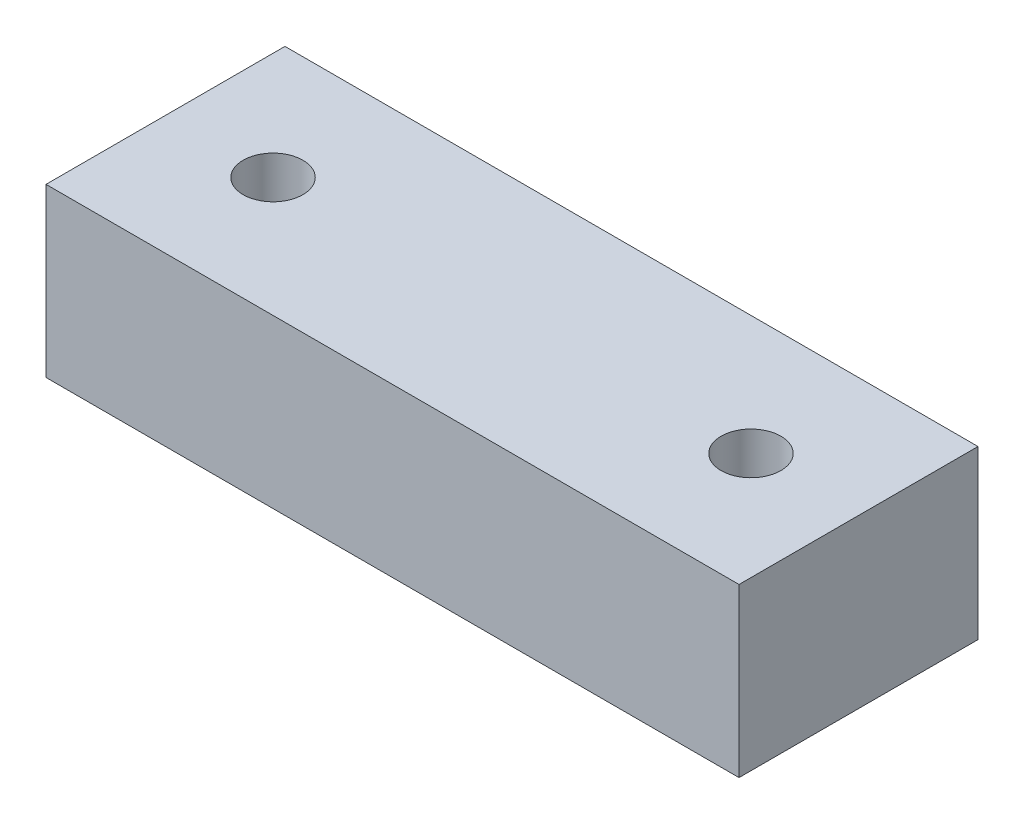
ISO-10303-21;
HEADER;
FILE_DESCRIPTION(('STEP AP214'),'2;1');
FILE_NAME('part.step','',(''),(''),'','','');
FILE_SCHEMA(('AUTOMOTIVE_DESIGN { 1 0 10303 214 1 1 1 1 }'));
ENDSEC;
DATA;
#1=APPLICATION_CONTEXT('core data for automotive mechanical design processes');
#2=APPLICATION_PROTOCOL_DEFINITION('international standard','automotive_design',2000,#1);
#3=PRODUCT_CONTEXT('',#1,'mechanical');
#4=PRODUCT('Part','Part','',(#3));
#5=PRODUCT_RELATED_PRODUCT_CATEGORY('part','',(#4));
#6=PRODUCT_DEFINITION_FORMATION('','',#4);
#7=PRODUCT_DEFINITION_CONTEXT('part definition',#1,'design');
#8=PRODUCT_DEFINITION('design','',#6,#7);
#9=PRODUCT_DEFINITION_SHAPE('','',#8);
#10=(LENGTH_UNIT() NAMED_UNIT(*) SI_UNIT(.MILLI.,.METRE.));
#11=(NAMED_UNIT(*) PLANE_ANGLE_UNIT() SI_UNIT($,.RADIAN.));
#12=(NAMED_UNIT(*) SI_UNIT($,.STERADIAN.) SOLID_ANGLE_UNIT());
#13=UNCERTAINTY_MEASURE_WITH_UNIT(LENGTH_MEASURE(1.E-05),#10,'distance_accuracy_value','');
#14=(GEOMETRIC_REPRESENTATION_CONTEXT(3) GLOBAL_UNCERTAINTY_ASSIGNED_CONTEXT((#13)) GLOBAL_UNIT_ASSIGNED_CONTEXT((#10,
#11,#12)) REPRESENTATION_CONTEXT('',''));
#15=CARTESIAN_POINT('',(0.,0.,0.));
#16=DIRECTION('',(0.,0.,1.));
#17=DIRECTION('',(1.,0.,0.));
#18=AXIS2_PLACEMENT_3D('',#15,#16,#17);
#19=CARTESIAN_POINT('',(0.,8.89,0.));
#20=DIRECTION('',(0.,1.,0.));
#21=DIRECTION('',(0.,0.,1.));
#22=AXIS2_PLACEMENT_3D('',#19,#20,#21);
#23=PLANE('',#22);
#24=CARTESIAN_POINT('',(5.715,8.89,6.35));
#25=DIRECTION('',(0.,1.,0.));
#26=DIRECTION('',(0.,0.,1.));
#27=AXIS2_PLACEMENT_3D('',#24,#25,#26);
#28=CIRCLE('',#27,1.5875);
#29=CARTESIAN_POINT('',(5.715,8.89,7.9375));
#30=VERTEX_POINT('',#29);
#31=EDGE_CURVE('E100',#30,#30,#28,.T.);
#32=ORIENTED_EDGE('',*,*,#31,.F.);
#33=EDGE_LOOP('',(#32));
#34=FACE_BOUND('',#33,.T.);
#35=DIRECTION('',(0.,0.,1.));
#36=VECTOR('',#35,1.);
#37=CARTESIAN_POINT('',(0.,8.89,0.));
#38=LINE('',#37,#36);
#39=CARTESIAN_POINT('',(0.,8.89,0.));
#40=VERTEX_POINT('',#39);
#41=CARTESIAN_POINT('',(0.,8.89,12.7));
#42=VERTEX_POINT('',#41);
#43=EDGE_CURVE('E85',#40,#42,#38,.T.);
#44=ORIENTED_EDGE('',*,*,#43,.T.);
#45=DIRECTION('',(1.,0.,0.));
#46=VECTOR('',#45,1.);
#47=CARTESIAN_POINT('',(0.,8.89,12.7));
#48=LINE('',#47,#46);
#49=CARTESIAN_POINT('',(36.83,8.89,12.7));
#50=VERTEX_POINT('',#49);
#51=EDGE_CURVE('E80',#42,#50,#48,.T.);
#52=ORIENTED_EDGE('',*,*,#51,.T.);
#53=DIRECTION('',(0.,0.,-1.));
#54=VECTOR('',#53,1.);
#55=CARTESIAN_POINT('',(36.83,8.89,0.));
#56=LINE('',#55,#54);
#57=CARTESIAN_POINT('',(36.83,8.89,0.));
#58=VERTEX_POINT('',#57);
#59=EDGE_CURVE('E83',#50,#58,#56,.T.);
#60=ORIENTED_EDGE('',*,*,#59,.T.);
#61=DIRECTION('',(-1.,0.,0.));
#62=VECTOR('',#61,1.);
#63=CARTESIAN_POINT('',(0.,8.89,0.));
#64=LINE('',#63,#62);
#65=EDGE_CURVE('E50',#58,#40,#64,.T.);
#66=ORIENTED_EDGE('',*,*,#65,.T.);
#67=EDGE_LOOP('',(#44,#52,#60,#66));
#68=FACE_BOUND('',#67,.T.);
#69=CARTESIAN_POINT('',(31.115,8.89,6.35));
#70=DIRECTION('',(0.,1.,0.));
#71=DIRECTION('',(0.,0.,1.));
#72=AXIS2_PLACEMENT_3D('',#69,#70,#71);
#73=CIRCLE('',#72,1.5875);
#74=CARTESIAN_POINT('',(31.115,8.89,7.9375));
#75=VERTEX_POINT('',#74);
#76=EDGE_CURVE('E115',#75,#75,#73,.T.);
#77=ORIENTED_EDGE('',*,*,#76,.F.);
#78=EDGE_LOOP('',(#77));
#79=FACE_BOUND('',#78,.T.);
#80=ADVANCED_FACE('F33',(#34,#68,#79),#23,.T.);
#81=CARTESIAN_POINT('',(0.,0.,0.));
#82=DIRECTION('',(0.,1.,0.));
#83=DIRECTION('',(0.,0.,1.));
#84=AXIS2_PLACEMENT_3D('',#81,#82,#83);
#85=PLANE('',#84);
#86=CARTESIAN_POINT('',(5.715,0.,6.35));
#87=DIRECTION('',(0.,1.,0.));
#88=DIRECTION('',(0.,0.,1.));
#89=AXIS2_PLACEMENT_3D('',#86,#87,#88);
#90=CIRCLE('',#89,1.5875);
#91=CARTESIAN_POINT('',(5.715,0.,7.9375));
#92=VERTEX_POINT('',#91);
#93=EDGE_CURVE('E112',#92,#92,#90,.T.);
#94=ORIENTED_EDGE('',*,*,#93,.T.);
#95=EDGE_LOOP('',(#94));
#96=FACE_BOUND('',#95,.T.);
#97=DIRECTION('',(0.,0.,1.));
#98=VECTOR('',#97,1.);
#99=CARTESIAN_POINT('',(0.,0.,0.));
#100=LINE('',#99,#98);
#101=CARTESIAN_POINT('',(0.,0.,0.));
#102=VERTEX_POINT('',#101);
#103=CARTESIAN_POINT('',(0.,0.,12.7));
#104=VERTEX_POINT('',#103);
#105=EDGE_CURVE('E97',#102,#104,#100,.T.);
#106=ORIENTED_EDGE('',*,*,#105,.F.);
#107=DIRECTION('',(-1.,0.,0.));
#108=VECTOR('',#107,1.);
#109=CARTESIAN_POINT('',(0.,0.,0.));
#110=LINE('',#109,#108);
#111=CARTESIAN_POINT('',(36.83,0.,0.));
#112=VERTEX_POINT('',#111);
#113=EDGE_CURVE('E73',#112,#102,#110,.T.);
#114=ORIENTED_EDGE('',*,*,#113,.F.);
#115=DIRECTION('',(0.,0.,-1.));
#116=VECTOR('',#115,1.);
#117=CARTESIAN_POINT('',(36.83,0.,0.));
#118=LINE('',#117,#116);
#119=CARTESIAN_POINT('',(36.83,0.,12.7));
#120=VERTEX_POINT('',#119);
#121=EDGE_CURVE('E67',#120,#112,#118,.T.);
#122=ORIENTED_EDGE('',*,*,#121,.F.);
#123=DIRECTION('',(1.,0.,0.));
#124=VECTOR('',#123,1.);
#125=CARTESIAN_POINT('',(0.,0.,12.7));
#126=LINE('',#125,#124);
#127=EDGE_CURVE('E89',#104,#120,#126,.T.);
#128=ORIENTED_EDGE('',*,*,#127,.F.);
#129=EDGE_LOOP('',(#106,#114,#122,#128));
#130=FACE_BOUND('',#129,.T.);
#131=CARTESIAN_POINT('',(31.115,0.,6.35));
#132=DIRECTION('',(0.,1.,0.));
#133=DIRECTION('',(0.,0.,1.));
#134=AXIS2_PLACEMENT_3D('',#131,#132,#133);
#135=CIRCLE('',#134,1.5875);
#136=CARTESIAN_POINT('',(31.115,0.,7.9375));
#137=VERTEX_POINT('',#136);
#138=EDGE_CURVE('E118',#137,#137,#135,.T.);
#139=ORIENTED_EDGE('',*,*,#138,.T.);
#140=EDGE_LOOP('',(#139));
#141=FACE_BOUND('',#140,.T.);
#142=ADVANCED_FACE('F108',(#96,#130,#141),#85,.F.);
#143=CARTESIAN_POINT('',(0.,8.89,0.));
#144=DIRECTION('',(1.,0.,0.));
#145=DIRECTION('',(0.,0.,-1.));
#146=AXIS2_PLACEMENT_3D('',#143,#144,#145);
#147=PLANE('',#146);
#148=ORIENTED_EDGE('',*,*,#105,.T.);
#149=DIRECTION('',(0.,-1.,0.));
#150=VECTOR('',#149,1.);
#151=CARTESIAN_POINT('',(0.,8.89,12.7));
#152=LINE('',#151,#150);
#153=EDGE_CURVE('E11',#42,#104,#152,.T.);
#154=ORIENTED_EDGE('',*,*,#153,.F.);
#155=ORIENTED_EDGE('',*,*,#43,.F.);
#156=DIRECTION('',(0.,-1.,0.));
#157=VECTOR('',#156,1.);
#158=CARTESIAN_POINT('',(0.,8.89,0.));
#159=LINE('',#158,#157);
#160=EDGE_CURVE('E93',#40,#102,#159,.T.);
#161=ORIENTED_EDGE('',*,*,#160,.T.);
#162=EDGE_LOOP('',(#148,#154,#155,#161));
#163=FACE_BOUND('',#162,.T.);
#164=ADVANCED_FACE('F35',(#163),#147,.F.);
#165=CARTESIAN_POINT('',(0.,8.89,12.7));
#166=DIRECTION('',(0.,0.,-1.));
#167=DIRECTION('',(-1.,0.,0.));
#168=AXIS2_PLACEMENT_3D('',#165,#166,#167);
#169=PLANE('',#168);
#170=ORIENTED_EDGE('',*,*,#127,.T.);
#171=DIRECTION('',(0.,-1.,0.));
#172=VECTOR('',#171,1.);
#173=CARTESIAN_POINT('',(36.83,8.89,12.7));
#174=LINE('',#173,#172);
#175=EDGE_CURVE('E42',#50,#120,#174,.T.);
#176=ORIENTED_EDGE('',*,*,#175,.F.);
#177=ORIENTED_EDGE('',*,*,#51,.F.);
#178=ORIENTED_EDGE('',*,*,#153,.T.);
#179=EDGE_LOOP('',(#170,#176,#177,#178));
#180=FACE_BOUND('',#179,.T.);
#181=ADVANCED_FACE('F88',(#180),#169,.F.);
#182=CARTESIAN_POINT('',(36.83,8.89,0.));
#183=DIRECTION('',(-1.,0.,0.));
#184=DIRECTION('',(0.,0.,1.));
#185=AXIS2_PLACEMENT_3D('',#182,#183,#184);
#186=PLANE('',#185);
#187=ORIENTED_EDGE('',*,*,#121,.T.);
#188=DIRECTION('',(0.,-1.,0.));
#189=VECTOR('',#188,1.);
#190=CARTESIAN_POINT('',(36.83,8.89,0.));
#191=LINE('',#190,#189);
#192=EDGE_CURVE('E90',#58,#112,#191,.T.);
#193=ORIENTED_EDGE('',*,*,#192,.F.);
#194=ORIENTED_EDGE('',*,*,#59,.F.);
#195=ORIENTED_EDGE('',*,*,#175,.T.);
#196=EDGE_LOOP('',(#187,#193,#194,#195));
#197=FACE_BOUND('',#196,.T.);
#198=ADVANCED_FACE('F91',(#197),#186,.F.);
#199=CARTESIAN_POINT('',(0.,8.89,0.));
#200=DIRECTION('',(0.,0.,1.));
#201=DIRECTION('',(1.,0.,0.));
#202=AXIS2_PLACEMENT_3D('',#199,#200,#201);
#203=PLANE('',#202);
#204=ORIENTED_EDGE('',*,*,#113,.T.);
#205=ORIENTED_EDGE('',*,*,#160,.F.);
#206=ORIENTED_EDGE('',*,*,#65,.F.);
#207=ORIENTED_EDGE('',*,*,#192,.T.);
#208=EDGE_LOOP('',(#204,#205,#206,#207));
#209=FACE_BOUND('',#208,.T.);
#210=ADVANCED_FACE('F105',(#209),#203,.F.);
#211=CARTESIAN_POINT('',(5.715,8.89,6.35));
#212=DIRECTION('',(0.,-1.,0.));
#213=DIRECTION('',(0.,0.,-1.));
#214=AXIS2_PLACEMENT_3D('',#211,#212,#213);
#215=CYLINDRICAL_SURFACE('',#214,1.5875);
#216=ORIENTED_EDGE('',*,*,#31,.T.);
#217=EDGE_LOOP('',(#216));
#218=FACE_BOUND('',#217,.T.);
#219=ORIENTED_EDGE('',*,*,#93,.F.);
#220=EDGE_LOOP('',(#219));
#221=FACE_BOUND('',#220,.T.);
#222=ADVANCED_FACE('F136',(#218,#221),#215,.F.);
#223=CARTESIAN_POINT('',(31.115,8.89,6.35));
#224=DIRECTION('',(0.,-1.,0.));
#225=DIRECTION('',(0.,0.,-1.));
#226=AXIS2_PLACEMENT_3D('',#223,#224,#225);
#227=CYLINDRICAL_SURFACE('',#226,1.5875);
#228=ORIENTED_EDGE('',*,*,#76,.T.);
#229=EDGE_LOOP('',(#228));
#230=FACE_BOUND('',#229,.T.);
#231=ORIENTED_EDGE('',*,*,#138,.F.);
#232=EDGE_LOOP('',(#231));
#233=FACE_BOUND('',#232,.T.);
#234=ADVANCED_FACE('F124',(#230,#233),#227,.F.);
#235=CLOSED_SHELL('',(#80,#142,#164,#181,#198,#210,#222,#234));
#236=MANIFOLD_SOLID_BREP('B2',#235);
#237=ADVANCED_BREP_SHAPE_REPRESENTATION('',(#18,#236),#14);
#238=SHAPE_DEFINITION_REPRESENTATION(#9,#237);
ENDSEC;
END-ISO-10303-21;
